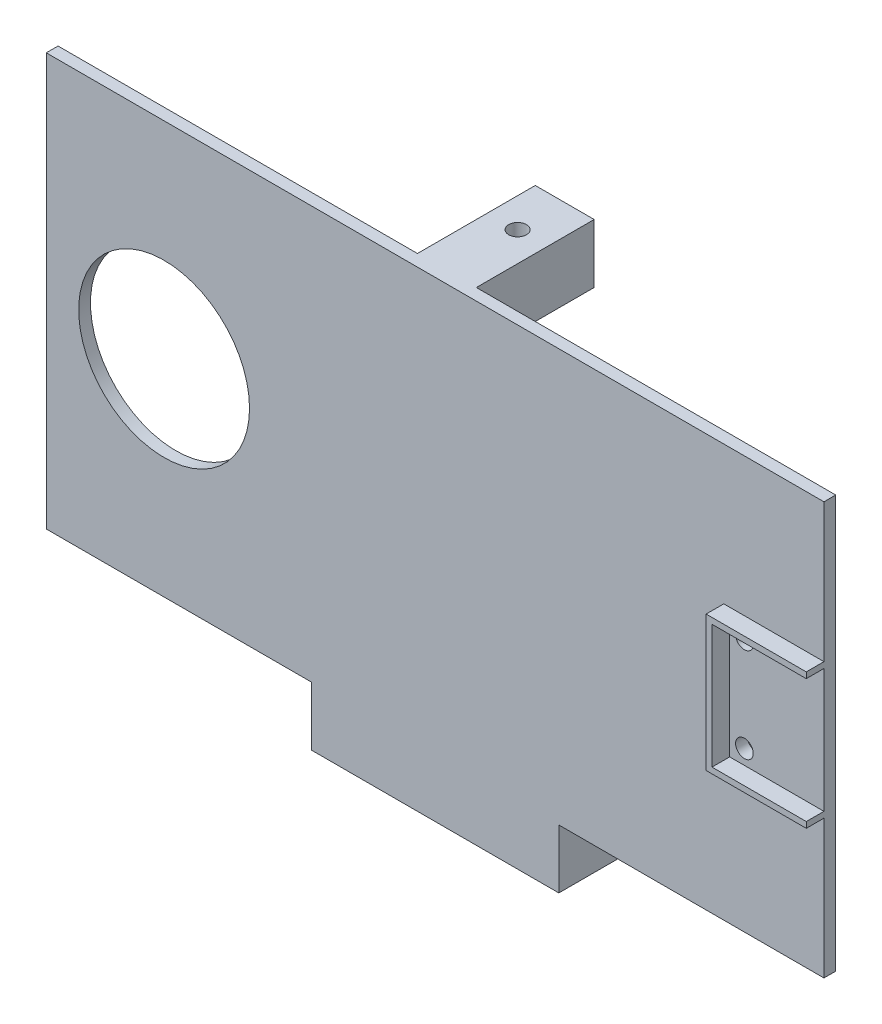
ISO-10303-21;
HEADER;
FILE_DESCRIPTION(('STEP AP214'),'2;1');
FILE_NAME('part.step','',(''),(''),'','','');
FILE_SCHEMA(('AUTOMOTIVE_DESIGN { 1 0 10303 214 1 1 1 1 }'));
ENDSEC;
DATA;
#1=APPLICATION_CONTEXT('core data for automotive mechanical design processes');
#2=APPLICATION_PROTOCOL_DEFINITION('international standard','automotive_design',2000,#1);
#3=PRODUCT_CONTEXT('',#1,'mechanical');
#4=PRODUCT('Part','Part','',(#3));
#5=PRODUCT_RELATED_PRODUCT_CATEGORY('part','',(#4));
#6=PRODUCT_DEFINITION_FORMATION('','',#4);
#7=PRODUCT_DEFINITION_CONTEXT('part definition',#1,'design');
#8=PRODUCT_DEFINITION('design','',#6,#7);
#9=PRODUCT_DEFINITION_SHAPE('','',#8);
#10=(LENGTH_UNIT() NAMED_UNIT(*) SI_UNIT(.MILLI.,.METRE.));
#11=(NAMED_UNIT(*) PLANE_ANGLE_UNIT() SI_UNIT($,.RADIAN.));
#12=(NAMED_UNIT(*) SI_UNIT($,.STERADIAN.) SOLID_ANGLE_UNIT());
#13=UNCERTAINTY_MEASURE_WITH_UNIT(LENGTH_MEASURE(1.E-05),#10,'distance_accuracy_value','');
#14=(GEOMETRIC_REPRESENTATION_CONTEXT(3) GLOBAL_UNCERTAINTY_ASSIGNED_CONTEXT((#13)) GLOBAL_UNIT_ASSIGNED_CONTEXT((#10,
#11,#12)) REPRESENTATION_CONTEXT('',''));
#15=CARTESIAN_POINT('',(0.,0.,0.));
#16=DIRECTION('',(0.,0.,1.));
#17=DIRECTION('',(1.,0.,0.));
#18=AXIS2_PLACEMENT_3D('',#15,#16,#17);
#19=CARTESIAN_POINT('',(0.,0.,0.));
#20=DIRECTION('',(0.,0.,-1.));
#21=DIRECTION('',(-1.,0.,0.));
#22=AXIS2_PLACEMENT_3D('',#19,#20,#21);
#23=PLANE('',#22);
#24=CARTESIAN_POINT('',(52.5,-8.,0.));
#25=DIRECTION('',(0.,0.,-1.));
#26=DIRECTION('',(-1.,0.,0.));
#27=AXIS2_PLACEMENT_3D('',#24,#25,#26);
#28=CIRCLE('',#27,1.5);
#29=CARTESIAN_POINT('',(51.,-8.,0.));
#30=VERTEX_POINT('',#29);
#31=EDGE_CURVE('E350',#30,#30,#28,.F.);
#32=ORIENTED_EDGE('',*,*,#31,.T.);
#33=EDGE_LOOP('',(#32));
#34=FACE_BOUND('',#33,.T.);
#35=CARTESIAN_POINT('',(52.5,8.,0.));
#36=DIRECTION('',(0.,0.,-1.));
#37=DIRECTION('',(-1.,0.,0.));
#38=AXIS2_PLACEMENT_3D('',#35,#36,#37);
#39=CIRCLE('',#38,1.5);
#40=CARTESIAN_POINT('',(51.,8.,0.));
#41=VERTEX_POINT('',#40);
#42=EDGE_CURVE('E354',#41,#41,#39,.F.);
#43=ORIENTED_EDGE('',*,*,#42,.T.);
#44=EDGE_LOOP('',(#43));
#45=FACE_BOUND('',#44,.T.);
#46=CARTESIAN_POINT('',(-46.,0.,0.));
#47=DIRECTION('',(0.,0.,1.));
#48=DIRECTION('',(1.,0.,0.));
#49=AXIS2_PLACEMENT_3D('',#46,#47,#48);
#50=CIRCLE('',#49,14.5);
#51=CARTESIAN_POINT('',(-31.5,0.,0.));
#52=VERTEX_POINT('',#51);
#53=EDGE_CURVE('E422',#52,#52,#50,.T.);
#54=ORIENTED_EDGE('',*,*,#53,.T.);
#55=EDGE_LOOP('',(#54));
#56=FACE_BOUND('',#55,.T.);
#57=DIRECTION('',(1.,0.,0.));
#58=VECTOR('',#57,1.);
#59=CARTESIAN_POINT('',(21.,-25.,0.));
#60=LINE('',#59,#58);
#61=CARTESIAN_POINT('',(-21.,-25.,0.));
#62=VERTEX_POINT('',#61);
#63=CARTESIAN_POINT('',(21.,-25.,0.));
#64=VERTEX_POINT('',#63);
#65=EDGE_CURVE('E291',#62,#64,#60,.T.);
#66=ORIENTED_EDGE('',*,*,#65,.F.);
#67=DIRECTION('',(0.,-1.,0.));
#68=VECTOR('',#67,1.);
#69=CARTESIAN_POINT('',(-21.,0.,0.));
#70=LINE('',#69,#68);
#71=CARTESIAN_POINT('',(-21.,-35.,0.));
#72=VERTEX_POINT('',#71);
#73=EDGE_CURVE('E11',#62,#72,#70,.T.);
#74=ORIENTED_EDGE('',*,*,#73,.T.);
#75=DIRECTION('',(1.,0.,0.));
#76=VECTOR('',#75,1.);
#77=CARTESIAN_POINT('',(-66.,-35.,0.));
#78=LINE('',#77,#76);
#79=CARTESIAN_POINT('',(-66.,-35.,0.));
#80=VERTEX_POINT('',#79);
#81=EDGE_CURVE('E455',#80,#72,#78,.T.);
#82=ORIENTED_EDGE('',*,*,#81,.F.);
#83=DIRECTION('',(0.,-1.,0.));
#84=VECTOR('',#83,1.);
#85=CARTESIAN_POINT('',(-66.,-35.,0.));
#86=LINE('',#85,#84);
#87=CARTESIAN_POINT('',(-66.,35.,0.));
#88=VERTEX_POINT('',#87);
#89=EDGE_CURVE('E453',#88,#80,#86,.T.);
#90=ORIENTED_EDGE('',*,*,#89,.F.);
#91=DIRECTION('',(-1.,0.,0.));
#92=VECTOR('',#91,1.);
#93=CARTESIAN_POINT('',(-66.,35.,0.));
#94=LINE('',#93,#92);
#95=CARTESIAN_POINT('',(-5.,35.,0.));
#96=VERTEX_POINT('',#95);
#97=EDGE_CURVE('E449',#96,#88,#94,.T.);
#98=ORIENTED_EDGE('',*,*,#97,.F.);
#99=DIRECTION('',(0.,1.,0.));
#100=VECTOR('',#99,1.);
#101=CARTESIAN_POINT('',(-5.,25.,0.));
#102=LINE('',#101,#100);
#103=CARTESIAN_POINT('',(-5.,25.,0.));
#104=VERTEX_POINT('',#103);
#105=EDGE_CURVE('E328',#104,#96,#102,.T.);
#106=ORIENTED_EDGE('',*,*,#105,.F.);
#107=DIRECTION('',(-1.,0.,0.));
#108=VECTOR('',#107,1.);
#109=CARTESIAN_POINT('',(5.,25.,0.));
#110=LINE('',#109,#108);
#111=CARTESIAN_POINT('',(5.,25.,0.));
#112=VERTEX_POINT('',#111);
#113=EDGE_CURVE('E55',#112,#104,#110,.T.);
#114=ORIENTED_EDGE('',*,*,#113,.F.);
#115=DIRECTION('',(0.,-1.,0.));
#116=VECTOR('',#115,1.);
#117=CARTESIAN_POINT('',(5.,25.,0.));
#118=LINE('',#117,#116);
#119=CARTESIAN_POINT('',(5.,35.,0.));
#120=VERTEX_POINT('',#119);
#121=EDGE_CURVE('E323',#120,#112,#118,.T.);
#122=ORIENTED_EDGE('',*,*,#121,.F.);
#123=CARTESIAN_POINT('',(66.,35.,0.));
#124=VERTEX_POINT('',#123);
#125=EDGE_CURVE('E450',#124,#120,#94,.T.);
#126=ORIENTED_EDGE('',*,*,#125,.F.);
#127=DIRECTION('',(0.,1.,0.));
#128=VECTOR('',#127,1.);
#129=CARTESIAN_POINT('',(66.,-35.,0.));
#130=LINE('',#129,#128);
#131=CARTESIAN_POINT('',(66.,-35.,0.));
#132=VERTEX_POINT('',#131);
#133=EDGE_CURVE('E425',#132,#124,#130,.T.);
#134=ORIENTED_EDGE('',*,*,#133,.F.);
#135=DIRECTION('',(1.,0.,0.));
#136=VECTOR('',#135,1.);
#137=CARTESIAN_POINT('',(21.,-35.,0.));
#138=LINE('',#137,#136);
#139=CARTESIAN_POINT('',(21.,-35.,0.));
#140=VERTEX_POINT('',#139);
#141=EDGE_CURVE('E458',#140,#132,#138,.T.);
#142=ORIENTED_EDGE('',*,*,#141,.F.);
#143=DIRECTION('',(0.,-1.,0.));
#144=VECTOR('',#143,1.);
#145=CARTESIAN_POINT('',(21.,-25.,0.));
#146=LINE('',#145,#144);
#147=EDGE_CURVE('E307',#64,#140,#146,.T.);
#148=ORIENTED_EDGE('',*,*,#147,.F.);
#149=EDGE_LOOP('',(#66,#74,#82,#90,#98,#106,#114,#122,#126,#134,#142,#148));
#150=FACE_BOUND('',#149,.T.);
#151=ADVANCED_FACE('F32',(#34,#45,#56,#150),#23,.T.);
#152=CARTESIAN_POINT('',(0.,0.,2.));
#153=DIRECTION('',(0.,0.,-1.));
#154=DIRECTION('',(-1.,0.,0.));
#155=AXIS2_PLACEMENT_3D('',#152,#153,#154);
#156=PLANE('',#155);
#157=CARTESIAN_POINT('',(52.5,-8.,2.));
#158=DIRECTION('',(0.,0.,1.));
#159=DIRECTION('',(1.,0.,0.));
#160=AXIS2_PLACEMENT_3D('',#157,#158,#159);
#161=CIRCLE('',#160,1.5);
#162=CARTESIAN_POINT('',(54.,-8.,2.));
#163=VERTEX_POINT('',#162);
#164=EDGE_CURVE('E351',#163,#163,#161,.T.);
#165=ORIENTED_EDGE('',*,*,#164,.F.);
#166=EDGE_LOOP('',(#165));
#167=FACE_BOUND('',#166,.T.);
#168=CARTESIAN_POINT('',(52.5,8.,2.));
#169=DIRECTION('',(0.,0.,1.));
#170=DIRECTION('',(1.,0.,0.));
#171=AXIS2_PLACEMENT_3D('',#168,#169,#170);
#172=CIRCLE('',#171,1.5);
#173=CARTESIAN_POINT('',(54.,8.,2.));
#174=VERTEX_POINT('',#173);
#175=EDGE_CURVE('E357',#174,#174,#172,.T.);
#176=ORIENTED_EDGE('',*,*,#175,.F.);
#177=EDGE_LOOP('',(#176));
#178=FACE_BOUND('',#177,.T.);
#179=DIRECTION('',(1.,0.,0.));
#180=VECTOR('',#179,1.);
#181=CARTESIAN_POINT('',(66.,10.5,2.));
#182=LINE('',#181,#180);
#183=CARTESIAN_POINT('',(50.,10.5,2.));
#184=VERTEX_POINT('',#183);
#185=CARTESIAN_POINT('',(66.,10.5,2.));
#186=VERTEX_POINT('',#185);
#187=EDGE_CURVE('E360',#184,#186,#182,.T.);
#188=ORIENTED_EDGE('',*,*,#187,.F.);
#189=DIRECTION('',(0.,1.,0.));
#190=VECTOR('',#189,1.);
#191=CARTESIAN_POINT('',(50.,-10.5,2.));
#192=LINE('',#191,#190);
#193=CARTESIAN_POINT('',(50.,-10.5,2.));
#194=VERTEX_POINT('',#193);
#195=EDGE_CURVE('E367',#194,#184,#192,.T.);
#196=ORIENTED_EDGE('',*,*,#195,.F.);
#197=DIRECTION('',(-1.,0.,0.));
#198=VECTOR('',#197,1.);
#199=CARTESIAN_POINT('',(66.,-10.5,2.));
#200=LINE('',#199,#198);
#201=CARTESIAN_POINT('',(66.,-10.5,2.));
#202=VERTEX_POINT('',#201);
#203=EDGE_CURVE('E393',#202,#194,#200,.T.);
#204=ORIENTED_EDGE('',*,*,#203,.F.);
#205=DIRECTION('',(0.,1.,0.));
#206=VECTOR('',#205,1.);
#207=CARTESIAN_POINT('',(66.,-35.,2.));
#208=LINE('',#207,#206);
#209=EDGE_CURVE('E431',#202,#186,#208,.T.);
#210=ORIENTED_EDGE('',*,*,#209,.T.);
#211=EDGE_LOOP('',(#188,#196,#204,#210));
#212=FACE_BOUND('',#211,.T.);
#213=ADVANCED_FACE('F519',(#167,#178,#212),#156,.F.);
#214=CARTESIAN_POINT('',(-46.,0.,2.));
#215=DIRECTION('',(0.,0.,1.));
#216=DIRECTION('',(1.,0.,0.));
#217=AXIS2_PLACEMENT_3D('',#214,#215,#216);
#218=CIRCLE('',#217,14.5);
#219=CARTESIAN_POINT('',(-31.5,0.,2.));
#220=VERTEX_POINT('',#219);
#221=EDGE_CURVE('E421',#220,#220,#218,.T.);
#222=ORIENTED_EDGE('',*,*,#221,.F.);
#223=EDGE_LOOP('',(#222));
#224=FACE_BOUND('',#223,.T.);
#225=DIRECTION('',(1.,0.,0.));
#226=VECTOR('',#225,1.);
#227=CARTESIAN_POINT('',(66.,-11.5,2.));
#228=LINE('',#227,#226);
#229=CARTESIAN_POINT('',(49.,-11.5,2.));
#230=VERTEX_POINT('',#229);
#231=CARTESIAN_POINT('',(66.,-11.5,2.));
#232=VERTEX_POINT('',#231);
#233=EDGE_CURVE('E390',#230,#232,#228,.T.);
#234=ORIENTED_EDGE('',*,*,#233,.F.);
#235=DIRECTION('',(0.,-1.,0.));
#236=VECTOR('',#235,1.);
#237=CARTESIAN_POINT('',(49.,-11.5,2.));
#238=LINE('',#237,#236);
#239=CARTESIAN_POINT('',(49.,11.5,2.));
#240=VERTEX_POINT('',#239);
#241=EDGE_CURVE('E387',#240,#230,#238,.T.);
#242=ORIENTED_EDGE('',*,*,#241,.F.);
#243=DIRECTION('',(-1.,0.,0.));
#244=VECTOR('',#243,1.);
#245=CARTESIAN_POINT('',(66.,11.5,2.));
#246=LINE('',#245,#244);
#247=CARTESIAN_POINT('',(66.,11.5,2.));
#248=VERTEX_POINT('',#247);
#249=EDGE_CURVE('E384',#248,#240,#246,.T.);
#250=ORIENTED_EDGE('',*,*,#249,.F.);
#251=CARTESIAN_POINT('',(66.,35.,2.));
#252=VERTEX_POINT('',#251);
#253=EDGE_CURVE('E432',#248,#252,#208,.T.);
#254=ORIENTED_EDGE('',*,*,#253,.T.);
#255=DIRECTION('',(-1.,0.,0.));
#256=VECTOR('',#255,1.);
#257=CARTESIAN_POINT('',(-66.,35.,2.));
#258=LINE('',#257,#256);
#259=CARTESIAN_POINT('',(-66.,35.,2.));
#260=VERTEX_POINT('',#259);
#261=EDGE_CURVE('E430',#252,#260,#258,.T.);
#262=ORIENTED_EDGE('',*,*,#261,.T.);
#263=DIRECTION('',(0.,-1.,0.));
#264=VECTOR('',#263,1.);
#265=CARTESIAN_POINT('',(-66.,-35.,2.));
#266=LINE('',#265,#264);
#267=CARTESIAN_POINT('',(-66.,-35.,2.));
#268=VERTEX_POINT('',#267);
#269=EDGE_CURVE('E434',#260,#268,#266,.T.);
#270=ORIENTED_EDGE('',*,*,#269,.T.);
#271=DIRECTION('',(1.,0.,0.));
#272=VECTOR('',#271,1.);
#273=CARTESIAN_POINT('',(-66.,-35.,2.));
#274=LINE('',#273,#272);
#275=CARTESIAN_POINT('',(-21.,-35.,2.));
#276=VERTEX_POINT('',#275);
#277=EDGE_CURVE('E436',#268,#276,#274,.T.);
#278=ORIENTED_EDGE('',*,*,#277,.T.);
#279=DIRECTION('',(0.,-1.,0.));
#280=VECTOR('',#279,1.);
#281=CARTESIAN_POINT('',(-21.,-45.,2.));
#282=LINE('',#281,#280);
#283=CARTESIAN_POINT('',(-21.,-45.,2.));
#284=VERTEX_POINT('',#283);
#285=EDGE_CURVE('E438',#276,#284,#282,.T.);
#286=ORIENTED_EDGE('',*,*,#285,.T.);
#287=DIRECTION('',(1.,0.,0.));
#288=VECTOR('',#287,1.);
#289=CARTESIAN_POINT('',(21.,-45.,2.));
#290=LINE('',#289,#288);
#291=CARTESIAN_POINT('',(21.,-45.,2.));
#292=VERTEX_POINT('',#291);
#293=EDGE_CURVE('E440',#284,#292,#290,.T.);
#294=ORIENTED_EDGE('',*,*,#293,.T.);
#295=DIRECTION('',(0.,1.,0.));
#296=VECTOR('',#295,1.);
#297=CARTESIAN_POINT('',(21.,-45.,2.));
#298=LINE('',#297,#296);
#299=CARTESIAN_POINT('',(21.,-35.,2.));
#300=VERTEX_POINT('',#299);
#301=EDGE_CURVE('E442',#292,#300,#298,.T.);
#302=ORIENTED_EDGE('',*,*,#301,.T.);
#303=DIRECTION('',(1.,0.,0.));
#304=VECTOR('',#303,1.);
#305=CARTESIAN_POINT('',(21.,-35.,2.));
#306=LINE('',#305,#304);
#307=CARTESIAN_POINT('',(66.,-35.,2.));
#308=VERTEX_POINT('',#307);
#309=EDGE_CURVE('E444',#300,#308,#306,.T.);
#310=ORIENTED_EDGE('',*,*,#309,.T.);
#311=EDGE_CURVE('E428',#308,#232,#208,.T.);
#312=ORIENTED_EDGE('',*,*,#311,.T.);
#313=EDGE_LOOP('',(#234,#242,#250,#254,#262,#270,#278,#286,#294,#302,#310,#312));
#314=FACE_BOUND('',#313,.T.);
#315=ADVANCED_FACE('F525',(#224,#314),#156,.F.);
#316=CARTESIAN_POINT('',(66.,-35.,2.));
#317=DIRECTION('',(-1.,0.,0.));
#318=DIRECTION('',(0.,0.,1.));
#319=AXIS2_PLACEMENT_3D('',#316,#317,#318);
#320=PLANE('',#319);
#321=ORIENTED_EDGE('',*,*,#133,.T.);
#322=DIRECTION('',(0.,0.,-1.));
#323=VECTOR('',#322,1.);
#324=CARTESIAN_POINT('',(66.,35.,2.));
#325=LINE('',#324,#323);
#326=EDGE_CURVE('E40',#252,#124,#325,.T.);
#327=ORIENTED_EDGE('',*,*,#326,.F.);
#328=ORIENTED_EDGE('',*,*,#253,.F.);
#329=DIRECTION('',(0.,0.,-1.));
#330=VECTOR('',#329,1.);
#331=CARTESIAN_POINT('',(66.,11.5,5.));
#332=LINE('',#331,#330);
#333=CARTESIAN_POINT('',(66.,11.5,5.));
#334=VERTEX_POINT('',#333);
#335=EDGE_CURVE('E415',#334,#248,#332,.T.);
#336=ORIENTED_EDGE('',*,*,#335,.F.);
#337=DIRECTION('',(0.,1.,0.));
#338=VECTOR('',#337,1.);
#339=CARTESIAN_POINT('',(66.,11.5,5.));
#340=LINE('',#339,#338);
#341=CARTESIAN_POINT('',(66.,10.5,5.));
#342=VERTEX_POINT('',#341);
#343=EDGE_CURVE('E366',#342,#334,#340,.T.);
#344=ORIENTED_EDGE('',*,*,#343,.F.);
#345=DIRECTION('',(0.,0.,-1.));
#346=VECTOR('',#345,1.);
#347=CARTESIAN_POINT('',(66.,10.5,5.));
#348=LINE('',#347,#346);
#349=EDGE_CURVE('E418',#342,#186,#348,.T.);
#350=ORIENTED_EDGE('',*,*,#349,.T.);
#351=ORIENTED_EDGE('',*,*,#209,.F.);
#352=DIRECTION('',(0.,0.,-1.));
#353=VECTOR('',#352,1.);
#354=CARTESIAN_POINT('',(66.,-10.5,5.));
#355=LINE('',#354,#353);
#356=CARTESIAN_POINT('',(66.,-10.5,5.));
#357=VERTEX_POINT('',#356);
#358=EDGE_CURVE('E403',#357,#202,#355,.T.);
#359=ORIENTED_EDGE('',*,*,#358,.F.);
#360=DIRECTION('',(0.,1.,0.));
#361=VECTOR('',#360,1.);
#362=CARTESIAN_POINT('',(66.,-10.5,5.));
#363=LINE('',#362,#361);
#364=CARTESIAN_POINT('',(66.,-11.5,5.));
#365=VERTEX_POINT('',#364);
#366=EDGE_CURVE('E375',#365,#357,#363,.T.);
#367=ORIENTED_EDGE('',*,*,#366,.F.);
#368=DIRECTION('',(0.,0.,-1.));
#369=VECTOR('',#368,1.);
#370=CARTESIAN_POINT('',(66.,-11.5,5.));
#371=LINE('',#370,#369);
#372=EDGE_CURVE('E406',#365,#232,#371,.T.);
#373=ORIENTED_EDGE('',*,*,#372,.T.);
#374=ORIENTED_EDGE('',*,*,#311,.F.);
#375=DIRECTION('',(0.,0.,-1.));
#376=VECTOR('',#375,1.);
#377=CARTESIAN_POINT('',(66.,-35.,2.));
#378=LINE('',#377,#376);
#379=EDGE_CURVE('E446',#308,#132,#378,.T.);
#380=ORIENTED_EDGE('',*,*,#379,.T.);
#381=EDGE_LOOP('',(#321,#327,#328,#336,#344,#350,#351,#359,#367,#373,#374,#380));
#382=FACE_BOUND('',#381,.T.);
#383=ADVANCED_FACE('F34',(#382),#320,.F.);
#384=CARTESIAN_POINT('',(-66.,35.,2.));
#385=DIRECTION('',(0.,-1.,0.));
#386=DIRECTION('',(0.,0.,-1.));
#387=AXIS2_PLACEMENT_3D('',#384,#385,#386);
#388=PLANE('',#387);
#389=CARTESIAN_POINT('',(0.,35.,-12.));
#390=DIRECTION('',(0.,1.,0.));
#391=DIRECTION('',(0.,0.,1.));
#392=AXIS2_PLACEMENT_3D('',#389,#390,#391);
#393=CIRCLE('',#392,1.5);
#394=CARTESIAN_POINT('',(0.,35.,-10.5));
#395=VERTEX_POINT('',#394);
#396=EDGE_CURVE('E255',#395,#395,#393,.T.);
#397=ORIENTED_EDGE('',*,*,#396,.F.);
#398=EDGE_LOOP('',(#397));
#399=FACE_BOUND('',#398,.T.);
#400=ORIENTED_EDGE('',*,*,#125,.T.);
#401=DIRECTION('',(0.,0.,1.));
#402=VECTOR('',#401,1.);
#403=CARTESIAN_POINT('',(5.,35.,-20.));
#404=LINE('',#403,#402);
#405=CARTESIAN_POINT('',(5.,35.,-20.));
#406=VERTEX_POINT('',#405);
#407=EDGE_CURVE('E334',#406,#120,#404,.T.);
#408=ORIENTED_EDGE('',*,*,#407,.F.);
#409=DIRECTION('',(1.,0.,0.));
#410=VECTOR('',#409,1.);
#411=CARTESIAN_POINT('',(5.,35.,-20.));
#412=LINE('',#411,#410);
#413=CARTESIAN_POINT('',(-5.,35.,-20.));
#414=VERTEX_POINT('',#413);
#415=EDGE_CURVE('E332',#414,#406,#412,.T.);
#416=ORIENTED_EDGE('',*,*,#415,.F.);
#417=DIRECTION('',(0.,0.,1.));
#418=VECTOR('',#417,1.);
#419=CARTESIAN_POINT('',(-5.,35.,-20.));
#420=LINE('',#419,#418);
#421=EDGE_CURVE('E342',#414,#96,#420,.T.);
#422=ORIENTED_EDGE('',*,*,#421,.T.);
#423=ORIENTED_EDGE('',*,*,#97,.T.);
#424=DIRECTION('',(0.,0.,-1.));
#425=VECTOR('',#424,1.);
#426=CARTESIAN_POINT('',(-66.,35.,2.));
#427=LINE('',#426,#425);
#428=EDGE_CURVE('E475',#260,#88,#427,.T.);
#429=ORIENTED_EDGE('',*,*,#428,.F.);
#430=ORIENTED_EDGE('',*,*,#261,.F.);
#431=ORIENTED_EDGE('',*,*,#326,.T.);
#432=EDGE_LOOP('',(#400,#408,#416,#422,#423,#429,#430,#431));
#433=FACE_BOUND('',#432,.T.);
#434=ADVANCED_FACE('F481',(#399,#433),#388,.F.);
#435=CARTESIAN_POINT('',(-66.,-35.,2.));
#436=DIRECTION('',(1.,0.,0.));
#437=DIRECTION('',(0.,0.,-1.));
#438=AXIS2_PLACEMENT_3D('',#435,#436,#437);
#439=PLANE('',#438);
#440=ORIENTED_EDGE('',*,*,#89,.T.);
#441=DIRECTION('',(0.,0.,-1.));
#442=VECTOR('',#441,1.);
#443=CARTESIAN_POINT('',(-66.,-35.,2.));
#444=LINE('',#443,#442);
#445=EDGE_CURVE('E472',#268,#80,#444,.T.);
#446=ORIENTED_EDGE('',*,*,#445,.F.);
#447=ORIENTED_EDGE('',*,*,#269,.F.);
#448=ORIENTED_EDGE('',*,*,#428,.T.);
#449=EDGE_LOOP('',(#440,#446,#447,#448));
#450=FACE_BOUND('',#449,.T.);
#451=ADVANCED_FACE('F551',(#450),#439,.F.);
#452=CARTESIAN_POINT('',(-66.,-35.,2.));
#453=DIRECTION('',(0.,1.,0.));
#454=DIRECTION('',(0.,0.,1.));
#455=AXIS2_PLACEMENT_3D('',#452,#453,#454);
#456=PLANE('',#455);
#457=ORIENTED_EDGE('',*,*,#81,.T.);
#458=DIRECTION('',(0.,0.,-1.));
#459=VECTOR('',#458,1.);
#460=CARTESIAN_POINT('',(-21.,-35.,2.));
#461=LINE('',#460,#459);
#462=EDGE_CURVE('E469',#276,#72,#461,.T.);
#463=ORIENTED_EDGE('',*,*,#462,.F.);
#464=ORIENTED_EDGE('',*,*,#277,.F.);
#465=ORIENTED_EDGE('',*,*,#445,.T.);
#466=EDGE_LOOP('',(#457,#463,#464,#465));
#467=FACE_BOUND('',#466,.T.);
#468=ADVANCED_FACE('F547',(#467),#456,.F.);
#469=CARTESIAN_POINT('',(-21.,-45.,2.));
#470=DIRECTION('',(1.,0.,0.));
#471=DIRECTION('',(0.,0.,-1.));
#472=AXIS2_PLACEMENT_3D('',#469,#470,#471);
#473=PLANE('',#472);
#474=ORIENTED_EDGE('',*,*,#462,.T.);
#475=ORIENTED_EDGE('',*,*,#73,.F.);
#476=DIRECTION('',(0.,0.,1.));
#477=VECTOR('',#476,1.);
#478=CARTESIAN_POINT('',(-21.,-25.,-20.));
#479=LINE('',#478,#477);
#480=CARTESIAN_POINT('',(-21.,-25.,-20.));
#481=VERTEX_POINT('',#480);
#482=EDGE_CURVE('E320',#481,#62,#479,.T.);
#483=ORIENTED_EDGE('',*,*,#482,.F.);
#484=DIRECTION('',(0.,1.,0.));
#485=VECTOR('',#484,1.);
#486=CARTESIAN_POINT('',(-21.,-25.,-20.));
#487=LINE('',#486,#485);
#488=CARTESIAN_POINT('',(-21.,-45.,-20.));
#489=VERTEX_POINT('',#488);
#490=EDGE_CURVE('E303',#489,#481,#487,.T.);
#491=ORIENTED_EDGE('',*,*,#490,.F.);
#492=DIRECTION('',(0.,0.,-1.));
#493=VECTOR('',#492,1.);
#494=CARTESIAN_POINT('',(-21.,-45.,2.));
#495=LINE('',#494,#493);
#496=EDGE_CURVE('E467',#284,#489,#495,.T.);
#497=ORIENTED_EDGE('',*,*,#496,.F.);
#498=ORIENTED_EDGE('',*,*,#285,.F.);
#499=EDGE_LOOP('',(#474,#475,#483,#491,#497,#498));
#500=FACE_BOUND('',#499,.T.);
#501=ADVANCED_FACE('F543',(#500),#473,.F.);
#502=CARTESIAN_POINT('',(21.,-45.,2.));
#503=DIRECTION('',(0.,1.,0.));
#504=DIRECTION('',(-1.,0.,0.));
#505=AXIS2_PLACEMENT_3D('',#502,#503,#504);
#506=PLANE('',#505);
#507=DIRECTION('',(-0.9865722470675,0.,0.163325446015564));
#508=VECTOR('',#507,1.);
#509=CARTESIAN_POINT('',(3.93224868094456,-45.,-7.46817693293197));
#510=LINE('',#509,#508);
#511=CARTESIAN_POINT('',(16.4083136150389,-45.,-9.53356938233126));
#512=VERTEX_POINT('',#511);
#513=CARTESIAN_POINT('',(3.93224868094455,-45.,-7.46817693293197));
#514=VERTEX_POINT('',#513);
#515=EDGE_CURVE('E272',#512,#514,#510,.T.);
#516=ORIENTED_EDGE('',*,*,#515,.F.);
#517=CARTESIAN_POINT('',(16.,-45.,-12.));
#518=DIRECTION('',(0.,-1.,0.));
#519=DIRECTION('',(1.,0.,0.));
#520=AXIS2_PLACEMENT_3D('',#517,#518,#519);
#521=CIRCLE('',#520,2.5);
#522=CARTESIAN_POINT('',(16.4083136150389,-45.,-14.4664306176688));
#523=VERTEX_POINT('',#522);
#524=EDGE_CURVE('E47',#523,#512,#521,.T.);
#525=ORIENTED_EDGE('',*,*,#524,.F.);
#526=DIRECTION('',(0.986572247067501,0.,0.163325446015559));
#527=VECTOR('',#526,1.);
#528=CARTESIAN_POINT('',(3.93224868094463,-45.,-16.531823067068));
#529=LINE('',#528,#527);
#530=CARTESIAN_POINT('',(3.93224868094463,-45.,-16.531823067068));
#531=VERTEX_POINT('',#530);
#532=EDGE_CURVE('E249',#531,#523,#529,.T.);
#533=ORIENTED_EDGE('',*,*,#532,.F.);
#534=CARTESIAN_POINT('',(0.,-45.,-12.));
#535=DIRECTION('',(0.,-1.,0.));
#536=DIRECTION('',(1.,0.,0.));
#537=AXIS2_PLACEMENT_3D('',#534,#535,#536);
#538=CIRCLE('',#537,6.);
#539=CARTESIAN_POINT('',(-3.93224868094461,-45.,-16.531823067068));
#540=VERTEX_POINT('',#539);
#541=EDGE_CURVE('E252',#540,#531,#538,.T.);
#542=ORIENTED_EDGE('',*,*,#541,.F.);
#543=DIRECTION('',(0.986572494352558,0.,-0.16332395227575));
#544=VECTOR('',#543,1.);
#545=CARTESIAN_POINT('',(-3.93224868094461,-45.,-16.531823067068));
#546=LINE('',#545,#544);
#547=CARTESIAN_POINT('',(-16.4083098806776,-45.,-14.466450643208));
#548=VERTEX_POINT('',#547);
#549=EDGE_CURVE('E284',#548,#540,#546,.T.);
#550=ORIENTED_EDGE('',*,*,#549,.F.);
#551=CARTESIAN_POINT('',(-15.9999999999882,-45.,-12.0000194073266));
#552=DIRECTION('',(0.,-1.,0.));
#553=DIRECTION('',(1.,0.,0.));
#554=AXIS2_PLACEMENT_3D('',#551,#552,#553);
#555=CIRCLE('',#554,2.5);
#556=CARTESIAN_POINT('',(-16.4083173493735,-45.,-9.53358940787577));
#557=VERTEX_POINT('',#556);
#558=EDGE_CURVE('E281',#557,#548,#555,.T.);
#559=ORIENTED_EDGE('',*,*,#558,.F.);
#560=DIRECTION('',(-0.986571999780331,0.,-0.163326939754098));
#561=VECTOR('',#560,1.);
#562=CARTESIAN_POINT('',(-3.93224868094461,-45.,-7.46817693293204));
#563=LINE('',#562,#561);
#564=CARTESIAN_POINT('',(-3.93224868094461,-45.,-7.46817693293204));
#565=VERTEX_POINT('',#564);
#566=EDGE_CURVE('E278',#565,#557,#563,.T.);
#567=ORIENTED_EDGE('',*,*,#566,.F.);
#568=CARTESIAN_POINT('',(0.,-45.,-12.));
#569=DIRECTION('',(0.,-1.,0.));
#570=DIRECTION('',(1.,0.,0.));
#571=AXIS2_PLACEMENT_3D('',#568,#569,#570);
#572=CIRCLE('',#571,6.);
#573=EDGE_CURVE('E275',#514,#565,#572,.T.);
#574=ORIENTED_EDGE('',*,*,#573,.F.);
#575=EDGE_LOOP('',(#516,#525,#533,#542,#550,#559,#567,#574));
#576=FACE_BOUND('',#575,.T.);
#577=ORIENTED_EDGE('',*,*,#496,.T.);
#578=DIRECTION('',(-1.,0.,0.));
#579=VECTOR('',#578,1.);
#580=CARTESIAN_POINT('',(21.,-45.,-20.));
#581=LINE('',#580,#579);
#582=CARTESIAN_POINT('',(21.,-45.,-20.));
#583=VERTEX_POINT('',#582);
#584=EDGE_CURVE('E312',#583,#489,#581,.T.);
#585=ORIENTED_EDGE('',*,*,#584,.F.);
#586=DIRECTION('',(0.,0.,-1.));
#587=VECTOR('',#586,1.);
#588=CARTESIAN_POINT('',(21.,-45.,2.));
#589=LINE('',#588,#587);
#590=EDGE_CURVE('E465',#292,#583,#589,.T.);
#591=ORIENTED_EDGE('',*,*,#590,.F.);
#592=ORIENTED_EDGE('',*,*,#293,.F.);
#593=EDGE_LOOP('',(#577,#585,#591,#592));
#594=FACE_BOUND('',#593,.T.);
#595=ADVANCED_FACE('F539',(#576,#594),#506,.F.);
#596=CARTESIAN_POINT('',(21.,-45.,2.));
#597=DIRECTION('',(-1.,0.,0.));
#598=DIRECTION('',(0.,0.,1.));
#599=AXIS2_PLACEMENT_3D('',#596,#597,#598);
#600=PLANE('',#599);
#601=ORIENTED_EDGE('',*,*,#590,.T.);
#602=DIRECTION('',(0.,-1.,0.));
#603=VECTOR('',#602,1.);
#604=CARTESIAN_POINT('',(21.,-25.,-20.));
#605=LINE('',#604,#603);
#606=CARTESIAN_POINT('',(21.,-25.,-20.));
#607=VERTEX_POINT('',#606);
#608=EDGE_CURVE('E309',#607,#583,#605,.T.);
#609=ORIENTED_EDGE('',*,*,#608,.F.);
#610=DIRECTION('',(0.,0.,1.));
#611=VECTOR('',#610,1.);
#612=CARTESIAN_POINT('',(21.,-25.,-20.));
#613=LINE('',#612,#611);
#614=EDGE_CURVE('E315',#607,#64,#613,.T.);
#615=ORIENTED_EDGE('',*,*,#614,.T.);
#616=ORIENTED_EDGE('',*,*,#147,.T.);
#617=DIRECTION('',(0.,0.,-1.));
#618=VECTOR('',#617,1.);
#619=CARTESIAN_POINT('',(21.,-35.,2.));
#620=LINE('',#619,#618);
#621=EDGE_CURVE('E462',#300,#140,#620,.T.);
#622=ORIENTED_EDGE('',*,*,#621,.F.);
#623=ORIENTED_EDGE('',*,*,#301,.F.);
#624=EDGE_LOOP('',(#601,#609,#615,#616,#622,#623));
#625=FACE_BOUND('',#624,.T.);
#626=ADVANCED_FACE('F535',(#625),#600,.F.);
#627=CARTESIAN_POINT('',(21.,-35.,2.));
#628=DIRECTION('',(0.,1.,0.));
#629=DIRECTION('',(0.,0.,1.));
#630=AXIS2_PLACEMENT_3D('',#627,#628,#629);
#631=PLANE('',#630);
#632=ORIENTED_EDGE('',*,*,#141,.T.);
#633=ORIENTED_EDGE('',*,*,#379,.F.);
#634=ORIENTED_EDGE('',*,*,#309,.F.);
#635=ORIENTED_EDGE('',*,*,#621,.T.);
#636=EDGE_LOOP('',(#632,#633,#634,#635));
#637=FACE_BOUND('',#636,.T.);
#638=ADVANCED_FACE('F531',(#637),#631,.F.);
#639=CARTESIAN_POINT('',(-46.,0.,0.));
#640=DIRECTION('',(0.,0.,1.));
#641=DIRECTION('',(1.,0.,0.));
#642=AXIS2_PLACEMENT_3D('',#639,#640,#641);
#643=CYLINDRICAL_SURFACE('',#642,14.5);
#644=ORIENTED_EDGE('',*,*,#53,.F.);
#645=EDGE_LOOP('',(#644));
#646=FACE_BOUND('',#645,.T.);
#647=ORIENTED_EDGE('',*,*,#221,.T.);
#648=EDGE_LOOP('',(#647));
#649=FACE_BOUND('',#648,.T.);
#650=ADVANCED_FACE('F534',(#646,#649),#643,.F.);
#651=CARTESIAN_POINT('',(66.,10.5,5.));
#652=DIRECTION('',(0.,1.,0.));
#653=DIRECTION('',(-1.,0.,0.));
#654=AXIS2_PLACEMENT_3D('',#651,#652,#653);
#655=PLANE('',#654);
#656=ORIENTED_EDGE('',*,*,#187,.T.);
#657=ORIENTED_EDGE('',*,*,#349,.F.);
#658=DIRECTION('',(1.,0.,0.));
#659=VECTOR('',#658,1.);
#660=CARTESIAN_POINT('',(66.,10.5,5.));
#661=LINE('',#660,#659);
#662=CARTESIAN_POINT('',(50.,10.5,5.));
#663=VERTEX_POINT('',#662);
#664=EDGE_CURVE('E363',#663,#342,#661,.T.);
#665=ORIENTED_EDGE('',*,*,#664,.F.);
#666=DIRECTION('',(0.,0.,-1.));
#667=VECTOR('',#666,1.);
#668=CARTESIAN_POINT('',(50.,10.5,5.));
#669=LINE('',#668,#667);
#670=EDGE_CURVE('E381',#663,#184,#669,.T.);
#671=ORIENTED_EDGE('',*,*,#670,.T.);
#672=EDGE_LOOP('',(#656,#657,#665,#671));
#673=FACE_BOUND('',#672,.T.);
#674=ADVANCED_FACE('F751',(#673),#655,.F.);
#675=CARTESIAN_POINT('',(66.,11.5,5.));
#676=DIRECTION('',(0.,-1.,0.));
#677=DIRECTION('',(1.,0.,0.));
#678=AXIS2_PLACEMENT_3D('',#675,#676,#677);
#679=PLANE('',#678);
#680=ORIENTED_EDGE('',*,*,#249,.T.);
#681=DIRECTION('',(0.,0.,-1.));
#682=VECTOR('',#681,1.);
#683=CARTESIAN_POINT('',(49.,11.5,5.));
#684=LINE('',#683,#682);
#685=CARTESIAN_POINT('',(49.,11.5,5.));
#686=VERTEX_POINT('',#685);
#687=EDGE_CURVE('E412',#686,#240,#684,.T.);
#688=ORIENTED_EDGE('',*,*,#687,.F.);
#689=DIRECTION('',(-1.,0.,0.));
#690=VECTOR('',#689,1.);
#691=CARTESIAN_POINT('',(66.,11.5,5.));
#692=LINE('',#691,#690);
#693=EDGE_CURVE('E369',#334,#686,#692,.T.);
#694=ORIENTED_EDGE('',*,*,#693,.F.);
#695=ORIENTED_EDGE('',*,*,#335,.T.);
#696=EDGE_LOOP('',(#680,#688,#694,#695));
#697=FACE_BOUND('',#696,.T.);
#698=ADVANCED_FACE('F759',(#697),#679,.F.);
#699=CARTESIAN_POINT('',(49.,-11.5,5.));
#700=DIRECTION('',(1.,0.,0.));
#701=DIRECTION('',(0.,0.,-1.));
#702=AXIS2_PLACEMENT_3D('',#699,#700,#701);
#703=PLANE('',#702);
#704=ORIENTED_EDGE('',*,*,#241,.T.);
#705=DIRECTION('',(0.,0.,-1.));
#706=VECTOR('',#705,1.);
#707=CARTESIAN_POINT('',(49.,-11.5,5.));
#708=LINE('',#707,#706);
#709=CARTESIAN_POINT('',(49.,-11.5,5.));
#710=VERTEX_POINT('',#709);
#711=EDGE_CURVE('E409',#710,#230,#708,.T.);
#712=ORIENTED_EDGE('',*,*,#711,.F.);
#713=DIRECTION('',(0.,-1.,0.));
#714=VECTOR('',#713,1.);
#715=CARTESIAN_POINT('',(49.,-11.5,5.));
#716=LINE('',#715,#714);
#717=EDGE_CURVE('E371',#686,#710,#716,.T.);
#718=ORIENTED_EDGE('',*,*,#717,.F.);
#719=ORIENTED_EDGE('',*,*,#687,.T.);
#720=EDGE_LOOP('',(#704,#712,#718,#719));
#721=FACE_BOUND('',#720,.T.);
#722=ADVANCED_FACE('F768',(#721),#703,.F.);
#723=CARTESIAN_POINT('',(66.,-11.5,5.));
#724=DIRECTION('',(0.,1.,0.));
#725=DIRECTION('',(-1.,0.,0.));
#726=AXIS2_PLACEMENT_3D('',#723,#724,#725);
#727=PLANE('',#726);
#728=ORIENTED_EDGE('',*,*,#233,.T.);
#729=ORIENTED_EDGE('',*,*,#372,.F.);
#730=DIRECTION('',(1.,0.,0.));
#731=VECTOR('',#730,1.);
#732=CARTESIAN_POINT('',(66.,-11.5,5.));
#733=LINE('',#732,#731);
#734=EDGE_CURVE('E373',#710,#365,#733,.T.);
#735=ORIENTED_EDGE('',*,*,#734,.F.);
#736=ORIENTED_EDGE('',*,*,#711,.T.);
#737=EDGE_LOOP('',(#728,#729,#735,#736));
#738=FACE_BOUND('',#737,.T.);
#739=ADVANCED_FACE('F776',(#738),#727,.F.);
#740=CARTESIAN_POINT('',(66.,-10.5,5.));
#741=DIRECTION('',(0.,-1.,0.));
#742=DIRECTION('',(1.,0.,0.));
#743=AXIS2_PLACEMENT_3D('',#740,#741,#742);
#744=PLANE('',#743);
#745=ORIENTED_EDGE('',*,*,#203,.T.);
#746=DIRECTION('',(0.,0.,-1.));
#747=VECTOR('',#746,1.);
#748=CARTESIAN_POINT('',(50.,-10.5,5.));
#749=LINE('',#748,#747);
#750=CARTESIAN_POINT('',(50.,-10.5,5.));
#751=VERTEX_POINT('',#750);
#752=EDGE_CURVE('E400',#751,#194,#749,.T.);
#753=ORIENTED_EDGE('',*,*,#752,.F.);
#754=DIRECTION('',(-1.,0.,0.));
#755=VECTOR('',#754,1.);
#756=CARTESIAN_POINT('',(66.,-10.5,5.));
#757=LINE('',#756,#755);
#758=EDGE_CURVE('E377',#357,#751,#757,.T.);
#759=ORIENTED_EDGE('',*,*,#758,.F.);
#760=ORIENTED_EDGE('',*,*,#358,.T.);
#761=EDGE_LOOP('',(#745,#753,#759,#760));
#762=FACE_BOUND('',#761,.T.);
#763=ADVANCED_FACE('F784',(#762),#744,.F.);
#764=CARTESIAN_POINT('',(50.,-10.5,5.));
#765=DIRECTION('',(-1.,0.,0.));
#766=DIRECTION('',(0.,0.,1.));
#767=AXIS2_PLACEMENT_3D('',#764,#765,#766);
#768=PLANE('',#767);
#769=ORIENTED_EDGE('',*,*,#195,.T.);
#770=ORIENTED_EDGE('',*,*,#670,.F.);
#771=DIRECTION('',(0.,1.,0.));
#772=VECTOR('',#771,1.);
#773=CARTESIAN_POINT('',(50.,-10.5,5.));
#774=LINE('',#773,#772);
#775=EDGE_CURVE('E379',#751,#663,#774,.T.);
#776=ORIENTED_EDGE('',*,*,#775,.F.);
#777=ORIENTED_EDGE('',*,*,#752,.T.);
#778=EDGE_LOOP('',(#769,#770,#776,#777));
#779=FACE_BOUND('',#778,.T.);
#780=ADVANCED_FACE('F792',(#779),#768,.F.);
#781=CARTESIAN_POINT('',(0.,0.,5.));
#782=DIRECTION('',(0.,0.,-1.));
#783=DIRECTION('',(-1.,0.,0.));
#784=AXIS2_PLACEMENT_3D('',#781,#782,#783);
#785=PLANE('',#784);
#786=ORIENTED_EDGE('',*,*,#664,.T.);
#787=ORIENTED_EDGE('',*,*,#343,.T.);
#788=ORIENTED_EDGE('',*,*,#693,.T.);
#789=ORIENTED_EDGE('',*,*,#717,.T.);
#790=ORIENTED_EDGE('',*,*,#734,.T.);
#791=ORIENTED_EDGE('',*,*,#366,.T.);
#792=ORIENTED_EDGE('',*,*,#758,.T.);
#793=ORIENTED_EDGE('',*,*,#775,.T.);
#794=EDGE_LOOP('',(#786,#787,#788,#789,#790,#791,#792,#793));
#795=FACE_BOUND('',#794,.T.);
#796=ADVANCED_FACE('F800',(#795),#785,.F.);
#797=CARTESIAN_POINT('',(52.5,8.,-0.00100000000000013));
#798=DIRECTION('',(0.,0.,1.));
#799=DIRECTION('',(1.,0.,0.));
#800=AXIS2_PLACEMENT_3D('',#797,#798,#799);
#801=CYLINDRICAL_SURFACE('',#800,1.5);
#802=ORIENTED_EDGE('',*,*,#42,.F.);
#803=EDGE_LOOP('',(#802));
#804=FACE_BOUND('',#803,.T.);
#805=ORIENTED_EDGE('',*,*,#175,.T.);
#806=EDGE_LOOP('',(#805));
#807=FACE_BOUND('',#806,.T.);
#808=ADVANCED_FACE('F808',(#804,#807),#801,.F.);
#809=CARTESIAN_POINT('',(52.5,-8.,-0.00100000000000013));
#810=DIRECTION('',(0.,0.,1.));
#811=DIRECTION('',(1.,0.,0.));
#812=AXIS2_PLACEMENT_3D('',#809,#810,#811);
#813=CYLINDRICAL_SURFACE('',#812,1.5);
#814=ORIENTED_EDGE('',*,*,#31,.F.);
#815=EDGE_LOOP('',(#814));
#816=FACE_BOUND('',#815,.T.);
#817=ORIENTED_EDGE('',*,*,#164,.T.);
#818=EDGE_LOOP('',(#817));
#819=FACE_BOUND('',#818,.T.);
#820=ADVANCED_FACE('F515',(#816,#819),#813,.F.);
#821=CARTESIAN_POINT('',(5.,25.,-20.));
#822=DIRECTION('',(-1.,0.,0.));
#823=DIRECTION('',(0.,0.,1.));
#824=AXIS2_PLACEMENT_3D('',#821,#822,#823);
#825=PLANE('',#824);
#826=ORIENTED_EDGE('',*,*,#121,.T.);
#827=DIRECTION('',(0.,0.,1.));
#828=VECTOR('',#827,1.);
#829=CARTESIAN_POINT('',(5.,25.,-20.));
#830=LINE('',#829,#828);
#831=CARTESIAN_POINT('',(5.,25.,-20.));
#832=VERTEX_POINT('',#831);
#833=EDGE_CURVE('E348',#832,#112,#830,.T.);
#834=ORIENTED_EDGE('',*,*,#833,.F.);
#835=DIRECTION('',(0.,-1.,0.));
#836=VECTOR('',#835,1.);
#837=CARTESIAN_POINT('',(5.,25.,-20.));
#838=LINE('',#837,#836);
#839=EDGE_CURVE('E324',#406,#832,#838,.T.);
#840=ORIENTED_EDGE('',*,*,#839,.F.);
#841=ORIENTED_EDGE('',*,*,#407,.T.);
#842=EDGE_LOOP('',(#826,#834,#840,#841));
#843=FACE_BOUND('',#842,.T.);
#844=ADVANCED_FACE('F494',(#843),#825,.F.);
#845=CARTESIAN_POINT('',(5.,25.,-20.));
#846=DIRECTION('',(0.,1.,0.));
#847=DIRECTION('',(0.,0.,1.));
#848=AXIS2_PLACEMENT_3D('',#845,#846,#847);
#849=PLANE('',#848);
#850=CARTESIAN_POINT('',(0.,25.,-12.));
#851=DIRECTION('',(0.,1.,0.));
#852=DIRECTION('',(0.,0.,1.));
#853=AXIS2_PLACEMENT_3D('',#850,#851,#852);
#854=CIRCLE('',#853,1.5);
#855=CARTESIAN_POINT('',(0.,25.,-10.5));
#856=VERTEX_POINT('',#855);
#857=EDGE_CURVE('E273',#856,#856,#854,.F.);
#858=ORIENTED_EDGE('',*,*,#857,.F.);
#859=EDGE_LOOP('',(#858));
#860=FACE_BOUND('',#859,.T.);
#861=ORIENTED_EDGE('',*,*,#113,.T.);
#862=DIRECTION('',(0.,0.,1.));
#863=VECTOR('',#862,1.);
#864=CARTESIAN_POINT('',(-5.,25.,-20.));
#865=LINE('',#864,#863);
#866=CARTESIAN_POINT('',(-5.,25.,-20.));
#867=VERTEX_POINT('',#866);
#868=EDGE_CURVE('E345',#867,#104,#865,.T.);
#869=ORIENTED_EDGE('',*,*,#868,.F.);
#870=DIRECTION('',(-1.,0.,0.));
#871=VECTOR('',#870,1.);
#872=CARTESIAN_POINT('',(5.,25.,-20.));
#873=LINE('',#872,#871);
#874=EDGE_CURVE('E327',#832,#867,#873,.T.);
#875=ORIENTED_EDGE('',*,*,#874,.F.);
#876=ORIENTED_EDGE('',*,*,#833,.T.);
#877=EDGE_LOOP('',(#861,#869,#875,#876));
#878=FACE_BOUND('',#877,.T.);
#879=ADVANCED_FACE('F506',(#860,#878),#849,.F.);
#880=CARTESIAN_POINT('',(-5.,25.,-20.));
#881=DIRECTION('',(1.,0.,0.));
#882=DIRECTION('',(0.,0.,-1.));
#883=AXIS2_PLACEMENT_3D('',#880,#881,#882);
#884=PLANE('',#883);
#885=ORIENTED_EDGE('',*,*,#105,.T.);
#886=ORIENTED_EDGE('',*,*,#421,.F.);
#887=DIRECTION('',(0.,1.,0.));
#888=VECTOR('',#887,1.);
#889=CARTESIAN_POINT('',(-5.,25.,-20.));
#890=LINE('',#889,#888);
#891=EDGE_CURVE('E330',#867,#414,#890,.T.);
#892=ORIENTED_EDGE('',*,*,#891,.F.);
#893=ORIENTED_EDGE('',*,*,#868,.T.);
#894=EDGE_LOOP('',(#885,#886,#892,#893));
#895=FACE_BOUND('',#894,.T.);
#896=ADVANCED_FACE('F503',(#895),#884,.F.);
#897=CARTESIAN_POINT('',(0.,0.,-20.));
#898=DIRECTION('',(0.,0.,1.));
#899=DIRECTION('',(1.,0.,0.));
#900=AXIS2_PLACEMENT_3D('',#897,#898,#899);
#901=PLANE('',#900);
#902=ORIENTED_EDGE('',*,*,#839,.T.);
#903=ORIENTED_EDGE('',*,*,#874,.T.);
#904=ORIENTED_EDGE('',*,*,#891,.T.);
#905=ORIENTED_EDGE('',*,*,#415,.T.);
#906=EDGE_LOOP('',(#902,#903,#904,#905));
#907=FACE_BOUND('',#906,.T.);
#908=ADVANCED_FACE('F499',(#907),#901,.F.);
#909=CARTESIAN_POINT('',(21.,-25.,-20.));
#910=DIRECTION('',(0.,-1.,0.));
#911=DIRECTION('',(0.,0.,-1.));
#912=AXIS2_PLACEMENT_3D('',#909,#910,#911);
#913=PLANE('',#912);
#914=ORIENTED_EDGE('',*,*,#65,.T.);
#915=ORIENTED_EDGE('',*,*,#614,.F.);
#916=DIRECTION('',(1.,0.,0.));
#917=VECTOR('',#916,1.);
#918=CARTESIAN_POINT('',(21.,-25.,-20.));
#919=LINE('',#918,#917);
#920=EDGE_CURVE('E306',#481,#607,#919,.T.);
#921=ORIENTED_EDGE('',*,*,#920,.F.);
#922=ORIENTED_EDGE('',*,*,#482,.T.);
#923=EDGE_LOOP('',(#914,#915,#921,#922));
#924=FACE_BOUND('',#923,.T.);
#925=ADVANCED_FACE('F604',(#924),#913,.F.);
#926=CARTESIAN_POINT('',(0.,0.,-20.));
#927=DIRECTION('',(0.,0.,-1.));
#928=DIRECTION('',(-1.,0.,0.));
#929=AXIS2_PLACEMENT_3D('',#926,#927,#928);
#930=PLANE('',#929);
#931=ORIENTED_EDGE('',*,*,#490,.T.);
#932=ORIENTED_EDGE('',*,*,#920,.T.);
#933=ORIENTED_EDGE('',*,*,#608,.T.);
#934=ORIENTED_EDGE('',*,*,#584,.T.);
#935=EDGE_LOOP('',(#931,#932,#933,#934));
#936=FACE_BOUND('',#935,.T.);
#937=ADVANCED_FACE('F601',(#936),#930,.T.);
#938=CARTESIAN_POINT('',(16.,-39.,-12.));
#939=DIRECTION('',(0.,-1.,0.));
#940=DIRECTION('',(1.,0.,0.));
#941=AXIS2_PLACEMENT_3D('',#938,#939,#940);
#942=CYLINDRICAL_SURFACE('',#941,2.5);
#943=ORIENTED_EDGE('',*,*,#524,.T.);
#944=DIRECTION('',(0.,-1.,0.));
#945=VECTOR('',#944,1.);
#946=CARTESIAN_POINT('',(16.4083136150389,-39.,-9.53356938233126));
#947=LINE('',#946,#945);
#948=CARTESIAN_POINT('',(16.4083136150389,-39.,-9.53356938233126));
#949=VERTEX_POINT('',#948);
#950=EDGE_CURVE('E226',#949,#512,#947,.T.);
#951=ORIENTED_EDGE('',*,*,#950,.F.);
#952=CARTESIAN_POINT('',(16.,-39.,-12.));
#953=DIRECTION('',(0.,-1.,0.));
#954=DIRECTION('',(1.,0.,0.));
#955=AXIS2_PLACEMENT_3D('',#952,#953,#954);
#956=CIRCLE('',#955,2.5);
#957=CARTESIAN_POINT('',(16.4083136150389,-39.,-14.4664306176688));
#958=VERTEX_POINT('',#957);
#959=EDGE_CURVE('E230',#958,#949,#956,.T.);
#960=ORIENTED_EDGE('',*,*,#959,.F.);
#961=DIRECTION('',(0.,-1.,0.));
#962=VECTOR('',#961,1.);
#963=CARTESIAN_POINT('',(16.4083136150389,-39.,-14.4664306176688));
#964=LINE('',#963,#962);
#965=EDGE_CURVE('E289',#958,#523,#964,.T.);
#966=ORIENTED_EDGE('',*,*,#965,.T.);
#967=EDGE_LOOP('',(#943,#951,#960,#966));
#968=FACE_BOUND('',#967,.T.);
#969=ADVANCED_FACE('F228',(#968),#942,.F.);
#970=CARTESIAN_POINT('',(3.93224868094463,-39.,-16.531823067068));
#971=DIRECTION('',(0.163325446015559,0.,-0.986572247067501));
#972=DIRECTION('',(-0.986572247067501,0.,-0.163325446015559));
#973=AXIS2_PLACEMENT_3D('',#970,#971,#972);
#974=PLANE('',#973);
#975=ORIENTED_EDGE('',*,*,#532,.T.);
#976=ORIENTED_EDGE('',*,*,#965,.F.);
#977=DIRECTION('',(0.986572247067501,0.,0.163325446015559));
#978=VECTOR('',#977,1.);
#979=CARTESIAN_POINT('',(3.93224868094463,-39.,-16.531823067068));
#980=LINE('',#979,#978);
#981=CARTESIAN_POINT('',(3.93224868094463,-39.,-16.531823067068));
#982=VERTEX_POINT('',#981);
#983=EDGE_CURVE('E236',#982,#958,#980,.T.);
#984=ORIENTED_EDGE('',*,*,#983,.F.);
#985=DIRECTION('',(0.,-1.,0.));
#986=VECTOR('',#985,1.);
#987=CARTESIAN_POINT('',(3.93224868094463,-39.,-16.531823067068));
#988=LINE('',#987,#986);
#989=EDGE_CURVE('E292',#982,#531,#988,.T.);
#990=ORIENTED_EDGE('',*,*,#989,.T.);
#991=EDGE_LOOP('',(#975,#976,#984,#990));
#992=FACE_BOUND('',#991,.T.);
#993=ADVANCED_FACE('F573',(#992),#974,.F.);
#994=CARTESIAN_POINT('',(0.,-39.,-12.));
#995=DIRECTION('',(0.,-1.,0.));
#996=DIRECTION('',(1.,0.,0.));
#997=AXIS2_PLACEMENT_3D('',#994,#995,#996);
#998=CYLINDRICAL_SURFACE('',#997,6.);
#999=ORIENTED_EDGE('',*,*,#541,.T.);
#1000=ORIENTED_EDGE('',*,*,#989,.F.);
#1001=CARTESIAN_POINT('',(0.,-39.,-12.));
#1002=DIRECTION('',(0.,-1.,0.));
#1003=DIRECTION('',(1.,0.,0.));
#1004=AXIS2_PLACEMENT_3D('',#1001,#1002,#1003);
#1005=CIRCLE('',#1004,6.);
#1006=CARTESIAN_POINT('',(-3.93224868094461,-39.,-16.531823067068));
#1007=VERTEX_POINT('',#1006);
#1008=EDGE_CURVE('E268',#1007,#982,#1005,.T.);
#1009=ORIENTED_EDGE('',*,*,#1008,.F.);
#1010=DIRECTION('',(0.,-1.,0.));
#1011=VECTOR('',#1010,1.);
#1012=CARTESIAN_POINT('',(-3.93224868094461,-39.,-16.531823067068));
#1013=LINE('',#1012,#1011);
#1014=EDGE_CURVE('E294',#1007,#540,#1013,.T.);
#1015=ORIENTED_EDGE('',*,*,#1014,.T.);
#1016=EDGE_LOOP('',(#999,#1000,#1009,#1015));
#1017=FACE_BOUND('',#1016,.T.);
#1018=ADVANCED_FACE('F576',(#1017),#998,.F.);
#1019=CARTESIAN_POINT('',(-3.93224868094461,-39.,-16.531823067068));
#1020=DIRECTION('',(-0.16332395227575,0.,-0.986572494352558));
#1021=DIRECTION('',(-0.986572494352558,0.,0.16332395227575));
#1022=AXIS2_PLACEMENT_3D('',#1019,#1020,#1021);
#1023=PLANE('',#1022);
#1024=ORIENTED_EDGE('',*,*,#549,.T.);
#1025=ORIENTED_EDGE('',*,*,#1014,.F.);
#1026=DIRECTION('',(0.986572494352558,0.,-0.16332395227575));
#1027=VECTOR('',#1026,1.);
#1028=CARTESIAN_POINT('',(-3.93224868094461,-39.,-16.531823067068));
#1029=LINE('',#1028,#1027);
#1030=CARTESIAN_POINT('',(-16.4083098806776,-39.,-14.466450643208));
#1031=VERTEX_POINT('',#1030);
#1032=EDGE_CURVE('E265',#1031,#1007,#1029,.T.);
#1033=ORIENTED_EDGE('',*,*,#1032,.F.);
#1034=DIRECTION('',(0.,-1.,0.));
#1035=VECTOR('',#1034,1.);
#1036=CARTESIAN_POINT('',(-16.4083098806776,-39.,-14.466450643208));
#1037=LINE('',#1036,#1035);
#1038=EDGE_CURVE('E296',#1031,#548,#1037,.T.);
#1039=ORIENTED_EDGE('',*,*,#1038,.T.);
#1040=EDGE_LOOP('',(#1024,#1025,#1033,#1039));
#1041=FACE_BOUND('',#1040,.T.);
#1042=ADVANCED_FACE('F580',(#1041),#1023,.F.);
#1043=CARTESIAN_POINT('',(-15.9999999999882,-39.,-12.0000194073266));
#1044=DIRECTION('',(0.,-1.,0.));
#1045=DIRECTION('',(1.,0.,0.));
#1046=AXIS2_PLACEMENT_3D('',#1043,#1044,#1045);
#1047=CYLINDRICAL_SURFACE('',#1046,2.5);
#1048=ORIENTED_EDGE('',*,*,#558,.T.);
#1049=ORIENTED_EDGE('',*,*,#1038,.F.);
#1050=CARTESIAN_POINT('',(-15.9999999999882,-39.,-12.0000194073266));
#1051=DIRECTION('',(0.,-1.,0.));
#1052=DIRECTION('',(1.,0.,0.));
#1053=AXIS2_PLACEMENT_3D('',#1050,#1051,#1052);
#1054=CIRCLE('',#1053,2.5);
#1055=CARTESIAN_POINT('',(-16.4083173493735,-39.,-9.53358940787577));
#1056=VERTEX_POINT('',#1055);
#1057=EDGE_CURVE('E262',#1056,#1031,#1054,.T.);
#1058=ORIENTED_EDGE('',*,*,#1057,.F.);
#1059=DIRECTION('',(0.,-1.,0.));
#1060=VECTOR('',#1059,1.);
#1061=CARTESIAN_POINT('',(-16.4083173493735,-39.,-9.53358940787577));
#1062=LINE('',#1061,#1060);
#1063=EDGE_CURVE('E298',#1056,#557,#1062,.T.);
#1064=ORIENTED_EDGE('',*,*,#1063,.T.);
#1065=EDGE_LOOP('',(#1048,#1049,#1058,#1064));
#1066=FACE_BOUND('',#1065,.T.);
#1067=ADVANCED_FACE('F584',(#1066),#1047,.F.);
#1068=CARTESIAN_POINT('',(-3.93224868094461,-39.,-7.46817693293204));
#1069=DIRECTION('',(-0.163326939754098,0.,0.986571999780331));
#1070=DIRECTION('',(0.986571999780331,0.,0.163326939754098));
#1071=AXIS2_PLACEMENT_3D('',#1068,#1069,#1070);
#1072=PLANE('',#1071);
#1073=ORIENTED_EDGE('',*,*,#566,.T.);
#1074=ORIENTED_EDGE('',*,*,#1063,.F.);
#1075=DIRECTION('',(-0.986571999780331,0.,-0.163326939754098));
#1076=VECTOR('',#1075,1.);
#1077=CARTESIAN_POINT('',(-3.93224868094461,-39.,-7.46817693293204));
#1078=LINE('',#1077,#1076);
#1079=CARTESIAN_POINT('',(-3.93224868094461,-39.,-7.46817693293204));
#1080=VERTEX_POINT('',#1079);
#1081=EDGE_CURVE('E259',#1080,#1056,#1078,.T.);
#1082=ORIENTED_EDGE('',*,*,#1081,.F.);
#1083=DIRECTION('',(0.,-1.,0.));
#1084=VECTOR('',#1083,1.);
#1085=CARTESIAN_POINT('',(-3.93224868094461,-39.,-7.46817693293204));
#1086=LINE('',#1085,#1084);
#1087=EDGE_CURVE('E300',#1080,#565,#1086,.T.);
#1088=ORIENTED_EDGE('',*,*,#1087,.T.);
#1089=EDGE_LOOP('',(#1073,#1074,#1082,#1088));
#1090=FACE_BOUND('',#1089,.T.);
#1091=ADVANCED_FACE('F588',(#1090),#1072,.F.);
#1092=CARTESIAN_POINT('',(0.,-39.,-12.));
#1093=DIRECTION('',(0.,-1.,0.));
#1094=DIRECTION('',(1.,0.,0.));
#1095=AXIS2_PLACEMENT_3D('',#1092,#1093,#1094);
#1096=CYLINDRICAL_SURFACE('',#1095,6.);
#1097=ORIENTED_EDGE('',*,*,#573,.T.);
#1098=ORIENTED_EDGE('',*,*,#1087,.F.);
#1099=CARTESIAN_POINT('',(0.,-39.,-12.));
#1100=DIRECTION('',(0.,-1.,0.));
#1101=DIRECTION('',(1.,0.,0.));
#1102=AXIS2_PLACEMENT_3D('',#1099,#1100,#1101);
#1103=CIRCLE('',#1102,6.);
#1104=CARTESIAN_POINT('',(3.93224868094455,-39.,-7.46817693293197));
#1105=VERTEX_POINT('',#1104);
#1106=EDGE_CURVE('E244',#1105,#1080,#1103,.T.);
#1107=ORIENTED_EDGE('',*,*,#1106,.F.);
#1108=DIRECTION('',(0.,-1.,0.));
#1109=VECTOR('',#1108,1.);
#1110=CARTESIAN_POINT('',(3.93224868094455,-39.,-7.46817693293197));
#1111=LINE('',#1110,#1109);
#1112=EDGE_CURVE('E235',#1105,#514,#1111,.T.);
#1113=ORIENTED_EDGE('',*,*,#1112,.T.);
#1114=EDGE_LOOP('',(#1097,#1098,#1107,#1113));
#1115=FACE_BOUND('',#1114,.T.);
#1116=ADVANCED_FACE('F592',(#1115),#1096,.F.);
#1117=CARTESIAN_POINT('',(3.93224868094456,-39.,-7.46817693293197));
#1118=DIRECTION('',(0.163325446015564,0.,0.9865722470675));
#1119=DIRECTION('',(0.9865722470675,0.,-0.163325446015564));
#1120=AXIS2_PLACEMENT_3D('',#1117,#1118,#1119);
#1121=PLANE('',#1120);
#1122=ORIENTED_EDGE('',*,*,#515,.T.);
#1123=ORIENTED_EDGE('',*,*,#1112,.F.);
#1124=DIRECTION('',(-0.9865722470675,0.,0.163325446015564));
#1125=VECTOR('',#1124,1.);
#1126=CARTESIAN_POINT('',(3.93224868094456,-39.,-7.46817693293197));
#1127=LINE('',#1126,#1125);
#1128=EDGE_CURVE('E239',#949,#1105,#1127,.T.);
#1129=ORIENTED_EDGE('',*,*,#1128,.F.);
#1130=ORIENTED_EDGE('',*,*,#950,.T.);
#1131=EDGE_LOOP('',(#1122,#1123,#1129,#1130));
#1132=FACE_BOUND('',#1131,.T.);
#1133=ADVANCED_FACE('F240',(#1132),#1121,.F.);
#1134=CARTESIAN_POINT('',(16.,-39.,-12.));
#1135=DIRECTION('',(0.,-1.,0.));
#1136=DIRECTION('',(1.,0.,0.));
#1137=AXIS2_PLACEMENT_3D('',#1134,#1135,#1136);
#1138=PLANE('',#1137);
#1139=ORIENTED_EDGE('',*,*,#959,.T.);
#1140=ORIENTED_EDGE('',*,*,#1128,.T.);
#1141=ORIENTED_EDGE('',*,*,#1106,.T.);
#1142=ORIENTED_EDGE('',*,*,#1081,.T.);
#1143=ORIENTED_EDGE('',*,*,#1057,.T.);
#1144=ORIENTED_EDGE('',*,*,#1032,.T.);
#1145=ORIENTED_EDGE('',*,*,#1008,.T.);
#1146=ORIENTED_EDGE('',*,*,#983,.T.);
#1147=EDGE_LOOP('',(#1139,#1140,#1141,#1142,#1143,#1144,#1145,#1146));
#1148=FACE_BOUND('',#1147,.T.);
#1149=ADVANCED_FACE('F246',(#1148),#1138,.T.);
#1150=CARTESIAN_POINT('',(0.,-45.001,-12.));
#1151=DIRECTION('',(0.,1.,0.));
#1152=DIRECTION('',(0.,0.,1.));
#1153=AXIS2_PLACEMENT_3D('',#1150,#1151,#1152);
#1154=CYLINDRICAL_SURFACE('',#1153,1.5);
#1155=ORIENTED_EDGE('',*,*,#396,.T.);
#1156=EDGE_LOOP('',(#1155));
#1157=FACE_BOUND('',#1156,.T.);
#1158=ORIENTED_EDGE('',*,*,#857,.T.);
#1159=EDGE_LOOP('',(#1158));
#1160=FACE_BOUND('',#1159,.T.);
#1161=ADVANCED_FACE('F565',(#1157,#1160),#1154,.F.);
#1162=CLOSED_SHELL('',(#151,#213,#315,#383,#434,#451,#468,#501,#595,#626,#638,#650,#674,#698,
#722,#739,#763,#780,#796,#808,#820,#844,#879,#896,#908,#925,#937,#969,#993,#1018,#1042,#1067,
#1091,#1116,#1133,#1149,#1161));
#1163=MANIFOLD_SOLID_BREP('B2',#1162);
#1164=ADVANCED_BREP_SHAPE_REPRESENTATION('',(#18,#1163),#14);
#1165=SHAPE_DEFINITION_REPRESENTATION(#9,#1164);
ENDSEC;
END-ISO-10303-21;
